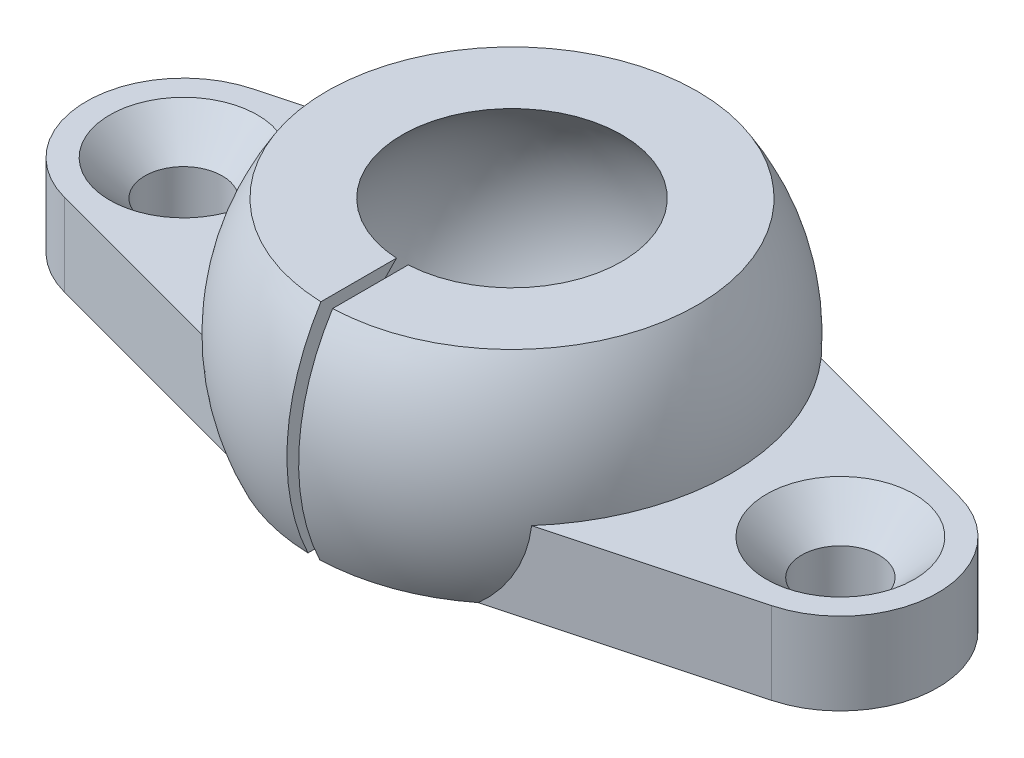
ISO-10303-21;
HEADER;
FILE_DESCRIPTION(('STEP AP214'),'2;1');
FILE_NAME('part.step','',(''),(''),'','','');
FILE_SCHEMA(('AUTOMOTIVE_DESIGN { 1 0 10303 214 1 1 1 1 }'));
ENDSEC;
DATA;
#1=APPLICATION_CONTEXT('core data for automotive mechanical design processes');
#2=APPLICATION_PROTOCOL_DEFINITION('international standard','automotive_design',2000,#1);
#3=PRODUCT_CONTEXT('',#1,'mechanical');
#4=PRODUCT('Part','Part','',(#3));
#5=PRODUCT_RELATED_PRODUCT_CATEGORY('part','',(#4));
#6=PRODUCT_DEFINITION_FORMATION('','',#4);
#7=PRODUCT_DEFINITION_CONTEXT('part definition',#1,'design');
#8=PRODUCT_DEFINITION('design','',#6,#7);
#9=PRODUCT_DEFINITION_SHAPE('','',#8);
#10=(LENGTH_UNIT() NAMED_UNIT(*) SI_UNIT(.MILLI.,.METRE.));
#11=(NAMED_UNIT(*) PLANE_ANGLE_UNIT() SI_UNIT($,.RADIAN.));
#12=(NAMED_UNIT(*) SI_UNIT($,.STERADIAN.) SOLID_ANGLE_UNIT());
#13=UNCERTAINTY_MEASURE_WITH_UNIT(LENGTH_MEASURE(1.E-05),#10,'distance_accuracy_value','');
#14=(GEOMETRIC_REPRESENTATION_CONTEXT(3) GLOBAL_UNCERTAINTY_ASSIGNED_CONTEXT((#13)) GLOBAL_UNIT_ASSIGNED_CONTEXT((#10,
#11,#12)) REPRESENTATION_CONTEXT('',''));
#15=CARTESIAN_POINT('',(0.,0.,0.));
#16=DIRECTION('',(0.,0.,1.));
#17=DIRECTION('',(1.,0.,0.));
#18=AXIS2_PLACEMENT_3D('',#15,#16,#17);
#19=CARTESIAN_POINT('',(0.,0.,0.));
#20=DIRECTION('',(0.,1.,0.));
#21=DIRECTION('',(-1.,0.,0.));
#22=AXIS2_PLACEMENT_3D('',#19,#20,#21);
#23=SPHERICAL_SURFACE('',#22,6.85);
#24=CARTESIAN_POINT('',(-0.25,0.,0.));
#25=DIRECTION('',(-1.,0.,0.));
#26=DIRECTION('',(0.,-1.,0.));
#27=AXIS2_PLACEMENT_3D('',#24,#25,#26);
#28=CIRCLE('',#27,6.84543643604993);
#29=CARTESIAN_POINT('',(-0.25,-3.56370593624109,5.84465567848098));
#30=VERTEX_POINT('',#29);
#31=CARTESIAN_POINT('',(-0.250000000000003,5.,4.67546789102438));
#32=VERTEX_POINT('',#31);
#33=EDGE_CURVE('E377',#30,#32,#28,.T.);
#34=ORIENTED_EDGE('',*,*,#33,.F.);
#35=CARTESIAN_POINT('',(0.,-3.56370593624109,0.));
#36=DIRECTION('',(0.,1.,0.));
#37=DIRECTION('',(-1.,0.,0.));
#38=AXIS2_PLACEMENT_3D('',#35,#36,#37);
#39=CIRCLE('',#38,5.85);
#40=CARTESIAN_POINT('',(0.25,-3.56370593624109,5.84465567848098));
#41=VERTEX_POINT('',#40);
#42=EDGE_CURVE('E371',#41,#30,#39,.T.);
#43=ORIENTED_EDGE('',*,*,#42,.F.);
#44=CARTESIAN_POINT('',(0.25,0.,0.));
#45=DIRECTION('',(-1.,0.,0.));
#46=DIRECTION('',(0.,-1.,0.));
#47=AXIS2_PLACEMENT_3D('',#44,#45,#46);
#48=CIRCLE('',#47,6.84543643604993);
#49=CARTESIAN_POINT('',(0.249999999999997,5.,4.67546789102438));
#50=VERTEX_POINT('',#49);
#51=EDGE_CURVE('E71',#41,#50,#48,.T.);
#52=ORIENTED_EDGE('',*,*,#51,.T.);
#53=CARTESIAN_POINT('',(0.,5.,0.));
#54=DIRECTION('',(0.,1.,0.));
#55=DIRECTION('',(-1.,0.,0.));
#56=AXIS2_PLACEMENT_3D('',#53,#54,#55);
#57=CIRCLE('',#56,4.68214694344378);
#58=EDGE_CURVE('E180',#50,#32,#57,.T.);
#59=ORIENTED_EDGE('',*,*,#58,.T.);
#60=EDGE_LOOP('',(#34,#43,#52,#59));
#61=FACE_BOUND('',#60,.T.);
#62=ADVANCED_FACE('F41',(#61),#23,.F.);
#63=CARTESIAN_POINT('',(-7.90079109963047,5.,0.));
#64=DIRECTION('',(0.,1.,0.));
#65=DIRECTION('',(-1.,0.,0.));
#66=AXIS2_PLACEMENT_3D('',#63,#64,#65);
#67=PLANE('',#66);
#68=DIRECTION('',(0.,0.,1.));
#69=VECTOR('',#68,1.);
#70=CARTESIAN_POINT('',(-0.250000000000001,5.,0.));
#71=LINE('',#70,#69);
#72=CARTESIAN_POINT('',(-0.250000000000003,5.,7.89683480895985));
#73=VERTEX_POINT('',#72);
#74=EDGE_CURVE('E144',#32,#73,#71,.T.);
#75=ORIENTED_EDGE('',*,*,#74,.F.);
#76=ORIENTED_EDGE('',*,*,#58,.F.);
#77=DIRECTION('',(0.,0.,1.));
#78=VECTOR('',#77,1.);
#79=CARTESIAN_POINT('',(0.249999999999999,5.,0.));
#80=LINE('',#79,#78);
#81=CARTESIAN_POINT('',(0.249999999999997,5.,7.89683480895985));
#82=VERTEX_POINT('',#81);
#83=EDGE_CURVE('E385',#50,#82,#80,.T.);
#84=ORIENTED_EDGE('',*,*,#83,.T.);
#85=CARTESIAN_POINT('',(0.,5.,0.));
#86=DIRECTION('',(0.,1.,0.));
#87=DIRECTION('',(-1.,0.,0.));
#88=AXIS2_PLACEMENT_3D('',#85,#86,#87);
#89=CIRCLE('',#88,7.90079109963047);
#90=EDGE_CURVE('E174',#82,#73,#89,.T.);
#91=ORIENTED_EDGE('',*,*,#90,.T.);
#92=EDGE_LOOP('',(#75,#76,#84,#91));
#93=FACE_BOUND('',#92,.T.);
#94=ADVANCED_FACE('F266',(#93),#67,.T.);
#95=CARTESIAN_POINT('',(0.,0.,0.));
#96=DIRECTION('',(0.,1.,0.));
#97=DIRECTION('',(-1.,0.,0.));
#98=AXIS2_PLACEMENT_3D('',#95,#96,#97);
#99=SPHERICAL_SURFACE('',#98,9.35);
#100=CARTESIAN_POINT('',(-0.25,0.,0.));
#101=DIRECTION('',(-1.,0.,0.));
#102=DIRECTION('',(0.,-1.,0.));
#103=AXIS2_PLACEMENT_3D('',#100,#101,#102);
#104=CIRCLE('',#103,9.34665715643834);
#105=CARTESIAN_POINT('',(-0.250000000000001,-4.00000000000001,8.44748483277715));
#106=VERTEX_POINT('',#105);
#107=EDGE_CURVE('E141',#73,#106,#104,.F.);
#108=ORIENTED_EDGE('',*,*,#107,.F.);
#109=ORIENTED_EDGE('',*,*,#90,.F.);
#110=CARTESIAN_POINT('',(0.25,0.,0.));
#111=DIRECTION('',(-1.,0.,0.));
#112=DIRECTION('',(0.,-1.,0.));
#113=AXIS2_PLACEMENT_3D('',#110,#111,#112);
#114=CIRCLE('',#113,9.34665715643834);
#115=CARTESIAN_POINT('',(0.249999999999999,-4.00000000000001,8.44748483277715));
#116=VERTEX_POINT('',#115);
#117=EDGE_CURVE('E379',#82,#116,#114,.F.);
#118=ORIENTED_EDGE('',*,*,#117,.T.);
#119=CARTESIAN_POINT('',(0.,-4.,0.));
#120=DIRECTION('',(0.,1.,0.));
#121=DIRECTION('',(-1.,0.,0.));
#122=AXIS2_PLACEMENT_3D('',#119,#120,#121);
#123=CIRCLE('',#122,8.45118334909378);
#124=CARTESIAN_POINT('',(5.21491093730875,-4.,6.65035366848543));
#125=VERTEX_POINT('',#124);
#126=EDGE_CURVE('E170',#116,#125,#123,.T.);
#127=ORIENTED_EDGE('',*,*,#126,.T.);
#128=CARTESIAN_POINT('',(2.01192121068436,0.,7.5085921790996));
#129=DIRECTION('',(0.258819045102518,0.,0.965925826289069));
#130=DIRECTION('',(0.965925826289069,0.,-0.258819045102518));
#131=AXIS2_PLACEMENT_3D('',#128,#129,#130);
#132=CIRCLE('',#131,5.19574022926114);
#133=CARTESIAN_POINT('',(7.00732842568334,-0.499999999999997,6.17007684997604));
#134=VERTEX_POINT('',#133);
#135=EDGE_CURVE('E362',#134,#125,#132,.F.);
#136=ORIENTED_EDGE('',*,*,#135,.F.);
#137=CARTESIAN_POINT('',(0.,-0.499999999999999,0.));
#138=DIRECTION('',(0.,-1.,0.));
#139=DIRECTION('',(1.,0.,0.));
#140=AXIS2_PLACEMENT_3D('',#137,#138,#139);
#141=CIRCLE('',#140,9.33662144461261);
#142=CARTESIAN_POINT('',(7.00732842568334,-0.499999999999997,-6.17007684997604));
#143=VERTEX_POINT('',#142);
#144=EDGE_CURVE('E184',#134,#143,#141,.F.);
#145=ORIENTED_EDGE('',*,*,#144,.T.);
#146=CARTESIAN_POINT('',(2.01192121068436,0.,-7.5085921790996));
#147=DIRECTION('',(0.258819045102518,0.,-0.965925826289069));
#148=DIRECTION('',(-0.965925826289069,0.,-0.258819045102518));
#149=AXIS2_PLACEMENT_3D('',#146,#147,#148);
#150=CIRCLE('',#149,5.19574022926114);
#151=CARTESIAN_POINT('',(5.21491093730875,-4.,-6.65035366848543));
#152=VERTEX_POINT('',#151);
#153=EDGE_CURVE('E368',#152,#143,#150,.F.);
#154=ORIENTED_EDGE('',*,*,#153,.F.);
#155=CARTESIAN_POINT('',(-5.21491093730875,-4.,-6.65035366848543));
#156=VERTEX_POINT('',#155);
#157=EDGE_CURVE('E169',#152,#156,#123,.T.);
#158=ORIENTED_EDGE('',*,*,#157,.T.);
#159=CARTESIAN_POINT('',(-2.01192121068436,0.,-7.5085921790996));
#160=DIRECTION('',(-0.258819045102518,0.,-0.965925826289069));
#161=DIRECTION('',(-0.965925826289069,0.,0.258819045102518));
#162=AXIS2_PLACEMENT_3D('',#159,#160,#161);
#163=CIRCLE('',#162,5.19574022926114);
#164=CARTESIAN_POINT('',(-7.00732842568334,-0.500000000000001,-6.17007684997604));
#165=VERTEX_POINT('',#164);
#166=EDGE_CURVE('E299',#165,#156,#163,.F.);
#167=ORIENTED_EDGE('',*,*,#166,.F.);
#168=CARTESIAN_POINT('',(0.,-0.499999999999999,0.));
#169=DIRECTION('',(0.,-1.,0.));
#170=DIRECTION('',(1.,0.,0.));
#171=AXIS2_PLACEMENT_3D('',#168,#169,#170);
#172=CIRCLE('',#171,9.33662144461261);
#173=CARTESIAN_POINT('',(-7.00732842568334,-0.500000000000001,6.17007684997604));
#174=VERTEX_POINT('',#173);
#175=EDGE_CURVE('E187',#165,#174,#172,.F.);
#176=ORIENTED_EDGE('',*,*,#175,.T.);
#177=CARTESIAN_POINT('',(-2.01192121068436,0.,7.50859217909961));
#178=DIRECTION('',(-0.258819045102518,0.,0.965925826289069));
#179=DIRECTION('',(0.965925826289069,0.,0.258819045102518));
#180=AXIS2_PLACEMENT_3D('',#177,#178,#179);
#181=CIRCLE('',#180,5.19574022926114);
#182=CARTESIAN_POINT('',(-5.21491093730875,-4.,6.65035366848543));
#183=VERTEX_POINT('',#182);
#184=EDGE_CURVE('E166',#183,#174,#181,.F.);
#185=ORIENTED_EDGE('',*,*,#184,.F.);
#186=EDGE_CURVE('E156',#183,#106,#123,.T.);
#187=ORIENTED_EDGE('',*,*,#186,.T.);
#188=EDGE_LOOP('',(#108,#109,#118,#127,#136,#145,#154,#158,#167,#176,#185,#187));
#189=FACE_BOUND('',#188,.T.);
#190=ADVANCED_FACE('F164',(#189),#99,.T.);
#191=CARTESIAN_POINT('',(-6.56619833921587,-4.,0.));
#192=DIRECTION('',(0.,-1.,0.));
#193=DIRECTION('',(1.,0.,0.));
#194=AXIS2_PLACEMENT_3D('',#191,#192,#193);
#195=PLANE('',#194);
#196=DIRECTION('',(0.,0.,1.));
#197=VECTOR('',#196,1.);
#198=CARTESIAN_POINT('',(-0.249999999999999,-4.00000000000001,0.));
#199=LINE('',#198,#197);
#200=CARTESIAN_POINT('',(-0.25,-4.,6.5614373905358));
#201=VERTEX_POINT('',#200);
#202=EDGE_CURVE('E63',#201,#106,#199,.T.);
#203=ORIENTED_EDGE('',*,*,#202,.T.);
#204=ORIENTED_EDGE('',*,*,#186,.F.);
#205=DIRECTION('',(-0.965925826289069,0.,-0.258819045102518));
#206=VECTOR('',#205,1.);
#207=CARTESIAN_POINT('',(-15.0740990371754,-4.,4.00859217909964));
#208=LINE('',#207,#206);
#209=CARTESIAN_POINT('',(-15.0740990371754,-4.,4.00859217909964));
#210=VERTEX_POINT('',#209);
#211=EDGE_CURVE('E308',#183,#210,#208,.T.);
#212=ORIENTED_EDGE('',*,*,#211,.T.);
#213=CARTESIAN_POINT('',(-14.,-4.,0.));
#214=DIRECTION('',(0.,-1.,0.));
#215=DIRECTION('',(1.,0.,0.));
#216=AXIS2_PLACEMENT_3D('',#213,#214,#215);
#217=CIRCLE('',#216,4.15);
#218=CARTESIAN_POINT('',(-15.0740990371754,-4.,-4.00859217909964));
#219=VERTEX_POINT('',#218);
#220=EDGE_CURVE('E312',#210,#219,#217,.T.);
#221=ORIENTED_EDGE('',*,*,#220,.T.);
#222=DIRECTION('',(0.965925826289069,0.,-0.258819045102518));
#223=VECTOR('',#222,1.);
#224=CARTESIAN_POINT('',(-3.37648299815732,-4.,-7.14295895012386));
#225=LINE('',#224,#223);
#226=EDGE_CURVE('E316',#219,#156,#225,.T.);
#227=ORIENTED_EDGE('',*,*,#226,.T.);
#228=ORIENTED_EDGE('',*,*,#157,.F.);
#229=DIRECTION('',(0.965925826289069,0.,0.258819045102518));
#230=VECTOR('',#229,1.);
#231=CARTESIAN_POINT('',(3.37648299815732,-4.,-7.14295895012386));
#232=LINE('',#231,#230);
#233=CARTESIAN_POINT('',(15.0740990371755,-3.99999999999999,-4.00859217909964));
#234=VERTEX_POINT('',#233);
#235=EDGE_CURVE('E341',#152,#234,#232,.T.);
#236=ORIENTED_EDGE('',*,*,#235,.T.);
#237=CARTESIAN_POINT('',(14.,-3.99999999999999,0.));
#238=DIRECTION('',(0.,-1.,0.));
#239=DIRECTION('',(1.,0.,0.));
#240=AXIS2_PLACEMENT_3D('',#237,#238,#239);
#241=CIRCLE('',#240,4.15);
#242=CARTESIAN_POINT('',(15.0740990371754,-3.99999999999999,4.00859217909964));
#243=VERTEX_POINT('',#242);
#244=EDGE_CURVE('E335',#234,#243,#241,.T.);
#245=ORIENTED_EDGE('',*,*,#244,.T.);
#246=DIRECTION('',(-0.965925826289069,0.,0.258819045102518));
#247=VECTOR('',#246,1.);
#248=CARTESIAN_POINT('',(15.0740990371754,-3.99999999999999,4.00859217909964));
#249=LINE('',#248,#247);
#250=EDGE_CURVE('E352',#243,#125,#249,.T.);
#251=ORIENTED_EDGE('',*,*,#250,.T.);
#252=ORIENTED_EDGE('',*,*,#126,.F.);
#253=DIRECTION('',(0.,0.,1.));
#254=VECTOR('',#253,1.);
#255=CARTESIAN_POINT('',(0.250000000000001,-4.00000000000001,0.));
#256=LINE('',#255,#254);
#257=CARTESIAN_POINT('',(0.25,-4.00000000000001,6.56143739053581));
#258=VERTEX_POINT('',#257);
#259=EDGE_CURVE('E162',#258,#116,#256,.T.);
#260=ORIENTED_EDGE('',*,*,#259,.F.);
#261=CARTESIAN_POINT('',(0.,-4.,0.));
#262=DIRECTION('',(0.,1.,0.));
#263=DIRECTION('',(-1.,0.,0.));
#264=AXIS2_PLACEMENT_3D('',#261,#262,#263);
#265=CIRCLE('',#264,6.56619833921587);
#266=EDGE_CURVE('E160',#258,#201,#265,.T.);
#267=ORIENTED_EDGE('',*,*,#266,.T.);
#268=EDGE_LOOP('',(#203,#204,#212,#221,#227,#228,#236,#245,#251,#252,#260,#267));
#269=FACE_BOUND('',#268,.T.);
#270=CARTESIAN_POINT('',(14.,-3.99999999999999,0.));
#271=DIRECTION('',(0.,-1.,0.));
#272=DIRECTION('',(1.,0.,0.));
#273=AXIS2_PLACEMENT_3D('',#270,#271,#272);
#274=CIRCLE('',#273,1.65);
#275=CARTESIAN_POINT('',(15.65,-3.99999999999999,0.));
#276=VERTEX_POINT('',#275);
#277=EDGE_CURVE('E331',#276,#276,#274,.T.);
#278=ORIENTED_EDGE('',*,*,#277,.F.);
#279=EDGE_LOOP('',(#278));
#280=FACE_BOUND('',#279,.T.);
#281=CARTESIAN_POINT('',(-14.,-4.,0.));
#282=DIRECTION('',(0.,-1.,0.));
#283=DIRECTION('',(1.,0.,0.));
#284=AXIS2_PLACEMENT_3D('',#281,#282,#283);
#285=CIRCLE('',#284,1.65);
#286=CARTESIAN_POINT('',(-12.35,-4.,0.));
#287=VERTEX_POINT('',#286);
#288=EDGE_CURVE('E150',#287,#287,#285,.T.);
#289=ORIENTED_EDGE('',*,*,#288,.F.);
#290=EDGE_LOOP('',(#289));
#291=FACE_BOUND('',#290,.T.);
#292=ADVANCED_FACE('F154',(#269,#280,#291),#195,.T.);
#293=CARTESIAN_POINT('',(0.,-4.,0.));
#294=DIRECTION('',(0.,-1.,0.));
#295=DIRECTION('',(1.,0.,0.));
#296=AXIS2_PLACEMENT_3D('',#293,#294,#295);
#297=CONICAL_SURFACE('',#296,6.56619833921587,1.02365378895935);
#298=CARTESIAN_POINT('',(-0.25,-4.0007,6.56258730886968));
#299=CARTESIAN_POINT('',(-0.25,-3.79203605968382,6.21979491039334));
#300=CARTESIAN_POINT('',(-0.25,-3.58338011025822,5.87699762131281));
#301=CARTESIAN_POINT('',(-0.25,-3.16612496373921,5.19136193314967));
#302=CARTESIAN_POINT('',(-0.25,-2.95752576748086,4.84852353355888));
#303=CARTESIAN_POINT('',(-0.25,-2.53926748953039,4.16087140498777));
#304=CARTESIAN_POINT('',(-0.25,-2.32960898600546,3.8160573244824));
#305=CARTESIAN_POINT('',(-0.25,-1.91049967216925,3.12630918369924));
#306=CARTESIAN_POINT('',(-0.25,-1.70104885908318,2.78137512510987));
#307=CARTESIAN_POINT('',(-0.25,-1.41538299560139,2.30996462605388));
#308=CARTESIAN_POINT('',(-0.25,-1.33889727185218,2.18365221667943));
#309=CARTESIAN_POINT('',(-0.25,-1.18606839080282,1.93093573838817));
#310=CARTESIAN_POINT('',(-0.25,-1.10972523795582,1.80453166677401));
#311=CARTESIAN_POINT('',(-0.25,-0.957514310010022,1.55190705866557));
#312=CARTESIAN_POINT('',(-0.25,-0.881645806424043,1.42568696048364));
#313=CARTESIAN_POINT('',(-0.25,-0.730429142164725,1.17294898469878));
#314=CARTESIAN_POINT('',(-0.25,-0.655080934891074,1.04643113516137));
#315=CARTESIAN_POINT('',(-0.25,-0.552756412658992,0.872338757139789));
#316=CARTESIAN_POINT('',(-0.25,-0.525148723513008,0.825136368574723));
#317=CARTESIAN_POINT('',(-0.25,-0.470273139245141,0.730520484331053));
#318=CARTESIAN_POINT('',(-0.25,-0.443005320769882,0.683106944193085));
#319=CARTESIAN_POINT('',(-0.25,-0.38888539201587,0.5876549449805));
#320=CARTESIAN_POINT('',(-0.25,-0.362036856629112,0.539614436692938));
#321=CARTESIAN_POINT('',(-0.25,-0.322661728981087,0.467077862729114));
#322=CARTESIAN_POINT('',(-0.25,-0.309688909797546,0.442824808098209));
#323=CARTESIAN_POINT('',(-0.25,-0.284196173906107,0.394082621666878));
#324=CARTESIAN_POINT('',(-0.25,-0.271676217966321,0.369593510550114));
#325=CARTESIAN_POINT('',(-0.25,-0.249566836729092,0.324767943894769));
#326=CARTESIAN_POINT('',(-0.25,-0.239859787385058,0.304489867526525));
#327=CARTESIAN_POINT('',(-0.25,-0.22116360840782,0.263608088254685));
#328=CARTESIAN_POINT('',(-0.25,-0.212174266350144,0.243004483878651));
#329=CARTESIAN_POINT('',(-0.25,-0.19540039459809,0.201555178192709));
#330=CARTESIAN_POINT('',(-0.25,-0.187604242941366,0.180714265584528));
#331=CARTESIAN_POINT('',(-0.25,-0.173758211726736,0.138471545690703));
#332=CARTESIAN_POINT('',(-0.25,-0.167705364282423,0.117070760151613));
#333=CARTESIAN_POINT('',(-0.25,-0.159597173477799,0.0796732806368716));
#334=CARTESIAN_POINT('',(-0.25,-0.156898971091526,0.0638215072081142));
#335=CARTESIAN_POINT('',(-0.25,-0.153206510816522,0.0317592753915554));
#336=CARTESIAN_POINT('',(-0.25,-0.152230243448775,0.0155468015782275));
#337=CARTESIAN_POINT('',(-0.25,-0.152295722476121,-0.000700000000000062));
#338=B_SPLINE_CURVE_WITH_KNOTS('',3,(#298,#299,#300,#301,#302,#303,#304,#305,#306,#307,#308,
#309,#310,#311,#312,#313,#314,#315,#316,#317,#318,#319,#320,#321,#322,#323,#324,#325,#326,#327,
#328,#329,#330,#331,#332,#333,#334,#335,#336,#337),.UNSPECIFIED.,.F.,.F.,(4,2,2,2,2,2,2,2,2,2,2,
2,2,2,2,2,2,2,2,4),(0.,1.20392089291616,2.40785863368443,3.61851178261971,4.82914853286378,
5.27214290352746,5.71515088701696,6.15695183477718,6.59871268560253,6.76276112611679,
6.92684591629358,7.09193697514014,7.17444811162307,7.25695208289951,7.3243887709009,
7.39180542465991,7.45851669046847,7.52511370319128,7.57326547989776,7.62191742391162),.UNSPECIFIED.);
#339=EDGE_CURVE('E11',#201,#30,#338,.T.);
#340=ORIENTED_EDGE('',*,*,#339,.F.);
#341=ORIENTED_EDGE('',*,*,#266,.F.);
#342=CARTESIAN_POINT('',(0.25,-4.0007,6.56258730886968));
#343=CARTESIAN_POINT('',(0.25,-3.79203605968382,6.21979491039334));
#344=CARTESIAN_POINT('',(0.25,-3.58338011025822,5.87699762131282));
#345=CARTESIAN_POINT('',(0.25,-3.16612496373921,5.19136193314968));
#346=CARTESIAN_POINT('',(0.25,-2.95752576748086,4.84852353355889));
#347=CARTESIAN_POINT('',(0.25,-2.5392674895304,4.16087140498779));
#348=CARTESIAN_POINT('',(0.25,-2.32960898600547,3.81605732448242));
#349=CARTESIAN_POINT('',(0.25,-1.91049967216927,3.12630918369926));
#350=CARTESIAN_POINT('',(0.25,-1.70104885908319,2.7813751251099));
#351=CARTESIAN_POINT('',(0.25,-1.41538299560141,2.3099646260539));
#352=CARTESIAN_POINT('',(0.25,-1.3388972718522,2.18365221667945));
#353=CARTESIAN_POINT('',(0.25,-1.18606839080283,1.93093573838819));
#354=CARTESIAN_POINT('',(0.25,-1.10972523795583,1.80453166677403));
#355=CARTESIAN_POINT('',(0.25,-0.957514310010032,1.55190705866558));
#356=CARTESIAN_POINT('',(0.25,-0.881645806424052,1.42568696048365));
#357=CARTESIAN_POINT('',(0.25,-0.730429142164732,1.17294898469879));
#358=CARTESIAN_POINT('',(0.25,-0.655080934891081,1.04643113516138));
#359=CARTESIAN_POINT('',(0.25,-0.552756412658997,0.872338757139797));
#360=CARTESIAN_POINT('',(0.25,-0.525148723513013,0.825136368574731));
#361=CARTESIAN_POINT('',(0.25,-0.470273139245145,0.73052048433106));
#362=CARTESIAN_POINT('',(0.25,-0.443005320769886,0.683106944193091));
#363=CARTESIAN_POINT('',(0.25,-0.388885392015873,0.587654944980505));
#364=CARTESIAN_POINT('',(0.25,-0.362036856629115,0.539614436692943));
#365=CARTESIAN_POINT('',(0.25,-0.32266172898109,0.467077862729118));
#366=CARTESIAN_POINT('',(0.25,-0.309688909797548,0.442824808098213));
#367=CARTESIAN_POINT('',(0.25,-0.284196173906109,0.394082621666881));
#368=CARTESIAN_POINT('',(0.25,-0.271676217966323,0.369593510550117));
#369=CARTESIAN_POINT('',(0.25,-0.249566836729094,0.324767943894772));
#370=CARTESIAN_POINT('',(0.25,-0.239859787385059,0.304489867526528));
#371=CARTESIAN_POINT('',(0.25,-0.221163608407821,0.263608088254689));
#372=CARTESIAN_POINT('',(0.25,-0.212174266350146,0.243004483878654));
#373=CARTESIAN_POINT('',(0.25,-0.195400394598092,0.201555178192711));
#374=CARTESIAN_POINT('',(0.25,-0.187604242941366,0.18071426558453));
#375=CARTESIAN_POINT('',(0.25,-0.173758211726737,0.138471545690704));
#376=CARTESIAN_POINT('',(0.25,-0.167705364282425,0.117070760151614));
#377=CARTESIAN_POINT('',(0.25,-0.159597173477801,0.0796732806368725));
#378=CARTESIAN_POINT('',(0.25,-0.156898971091527,0.063821507208115));
#379=CARTESIAN_POINT('',(0.25,-0.153206510816523,0.0317592753915559));
#380=CARTESIAN_POINT('',(0.25,-0.152230243448775,0.0155468015782278));
#381=CARTESIAN_POINT('',(0.25,-0.152295722476122,-0.000700000000000029));
#382=B_SPLINE_CURVE_WITH_KNOTS('',3,(#342,#343,#344,#345,#346,#347,#348,#349,#350,#351,#352,
#353,#354,#355,#356,#357,#358,#359,#360,#361,#362,#363,#364,#365,#366,#367,#368,#369,#370,#371,
#372,#373,#374,#375,#376,#377,#378,#379,#380,#381),.UNSPECIFIED.,.F.,.F.,(4,2,2,2,2,2,2,2,2,2,2,
2,2,2,2,2,2,2,2,4),(0.,1.20392089291615,2.40785863368442,3.61851178261969,4.82914853286375,
5.27214290352744,5.71515088701694,6.15695183477717,6.59871268560252,6.76276112611678,
6.92684591629357,7.09193697514014,7.17444811162307,7.25695208289951,7.3243887709009,
7.39180542465991,7.45851669046847,7.52511370319127,7.57326547989776,7.62191742391162),.UNSPECIFIED.);
#383=EDGE_CURVE('E57',#258,#41,#382,.T.);
#384=ORIENTED_EDGE('',*,*,#383,.T.);
#385=ORIENTED_EDGE('',*,*,#42,.T.);
#386=EDGE_LOOP('',(#340,#341,#384,#385));
#387=FACE_BOUND('',#386,.T.);
#388=ADVANCED_FACE('F211',(#387),#297,.F.);
#389=CARTESIAN_POINT('',(14.,-0.499999999999995,0.));
#390=DIRECTION('',(0.,-1.,0.));
#391=DIRECTION('',(1.,0.,0.));
#392=AXIS2_PLACEMENT_3D('',#389,#390,#391);
#393=CYLINDRICAL_SURFACE('',#392,4.15);
#394=ORIENTED_EDGE('',*,*,#244,.F.);
#395=DIRECTION('',(0.,-1.,0.));
#396=VECTOR('',#395,1.);
#397=CARTESIAN_POINT('',(15.0740990371755,-0.499999999999995,-4.00859217909964));
#398=LINE('',#397,#396);
#399=CARTESIAN_POINT('',(15.0740990371755,-0.499999999999995,-4.00859217909964));
#400=VERTEX_POINT('',#399);
#401=EDGE_CURVE('E358',#400,#234,#398,.T.);
#402=ORIENTED_EDGE('',*,*,#401,.F.);
#403=CARTESIAN_POINT('',(14.,-0.499999999999995,0.));
#404=DIRECTION('',(0.,-1.,0.));
#405=DIRECTION('',(1.,0.,0.));
#406=AXIS2_PLACEMENT_3D('',#403,#404,#405);
#407=CIRCLE('',#406,4.15);
#408=CARTESIAN_POINT('',(15.0740990371754,-0.499999999999995,4.00859217909964));
#409=VERTEX_POINT('',#408);
#410=EDGE_CURVE('E336',#400,#409,#407,.T.);
#411=ORIENTED_EDGE('',*,*,#410,.T.);
#412=DIRECTION('',(0.,-1.,0.));
#413=VECTOR('',#412,1.);
#414=CARTESIAN_POINT('',(15.0740990371754,-0.499999999999995,4.00859217909964));
#415=LINE('',#414,#413);
#416=EDGE_CURVE('E348',#409,#243,#415,.T.);
#417=ORIENTED_EDGE('',*,*,#416,.T.);
#418=EDGE_LOOP('',(#394,#402,#411,#417));
#419=FACE_BOUND('',#418,.T.);
#420=ADVANCED_FACE('F254',(#419),#393,.T.);
#421=CARTESIAN_POINT('',(3.37648299815732,-0.499999999999998,-7.14295895012386));
#422=DIRECTION('',(0.258819045102518,0.,-0.965925826289069));
#423=DIRECTION('',(-0.965925826289069,0.,-0.258819045102518));
#424=AXIS2_PLACEMENT_3D('',#421,#422,#423);
#425=PLANE('',#424);
#426=ORIENTED_EDGE('',*,*,#235,.F.);
#427=ORIENTED_EDGE('',*,*,#153,.T.);
#428=DIRECTION('',(0.965925826289069,0.,0.258819045102518));
#429=VECTOR('',#428,1.);
#430=CARTESIAN_POINT('',(3.37648299815732,-0.499999999999998,-7.14295895012386));
#431=LINE('',#430,#429);
#432=EDGE_CURVE('E345',#143,#400,#431,.T.);
#433=ORIENTED_EDGE('',*,*,#432,.T.);
#434=ORIENTED_EDGE('',*,*,#401,.T.);
#435=EDGE_LOOP('',(#426,#427,#433,#434));
#436=FACE_BOUND('',#435,.T.);
#437=ADVANCED_FACE('F251',(#436),#425,.T.);
#438=CARTESIAN_POINT('',(15.0740990371754,-0.499999999999995,4.00859217909964));
#439=DIRECTION('',(0.258819045102518,0.,0.965925826289069));
#440=DIRECTION('',(0.965925826289069,0.,-0.258819045102518));
#441=AXIS2_PLACEMENT_3D('',#438,#439,#440);
#442=PLANE('',#441);
#443=DIRECTION('',(-0.965925826289069,0.,0.258819045102518));
#444=VECTOR('',#443,1.);
#445=CARTESIAN_POINT('',(15.0740990371754,-0.499999999999995,4.00859217909964));
#446=LINE('',#445,#444);
#447=EDGE_CURVE('E340',#409,#134,#446,.T.);
#448=ORIENTED_EDGE('',*,*,#447,.T.);
#449=ORIENTED_EDGE('',*,*,#135,.T.);
#450=ORIENTED_EDGE('',*,*,#250,.F.);
#451=ORIENTED_EDGE('',*,*,#416,.F.);
#452=EDGE_LOOP('',(#448,#449,#450,#451));
#453=FACE_BOUND('',#452,.T.);
#454=ADVANCED_FACE('F249',(#453),#442,.T.);
#455=CARTESIAN_POINT('',(14.,-0.499999999999995,0.));
#456=DIRECTION('',(0.,-1.,0.));
#457=DIRECTION('',(1.,0.,0.));
#458=AXIS2_PLACEMENT_3D('',#455,#456,#457);
#459=PLANE('',#458);
#460=CARTESIAN_POINT('',(14.,-0.499999999999995,0.));
#461=DIRECTION('',(0.,-1.,0.));
#462=DIRECTION('',(1.,0.,0.));
#463=AXIS2_PLACEMENT_3D('',#460,#461,#462);
#464=CIRCLE('',#463,3.15);
#465=CARTESIAN_POINT('',(17.15,-0.499999999999994,0.));
#466=VERTEX_POINT('',#465);
#467=EDGE_CURVE('E198',#466,#466,#464,.T.);
#468=ORIENTED_EDGE('',*,*,#467,.T.);
#469=EDGE_LOOP('',(#468));
#470=FACE_BOUND('',#469,.T.);
#471=ORIENTED_EDGE('',*,*,#144,.F.);
#472=ORIENTED_EDGE('',*,*,#447,.F.);
#473=ORIENTED_EDGE('',*,*,#410,.F.);
#474=ORIENTED_EDGE('',*,*,#432,.F.);
#475=EDGE_LOOP('',(#471,#472,#473,#474));
#476=FACE_BOUND('',#475,.T.);
#477=ADVANCED_FACE('F245',(#470,#476),#459,.F.);
#478=CARTESIAN_POINT('',(14.,-0.499999999999995,0.));
#479=DIRECTION('',(0.,-1.,0.));
#480=DIRECTION('',(1.,0.,0.));
#481=AXIS2_PLACEMENT_3D('',#478,#479,#480);
#482=CYLINDRICAL_SURFACE('',#481,1.65);
#483=CARTESIAN_POINT('',(14.,-2.,0.));
#484=DIRECTION('',(0.,-1.,0.));
#485=DIRECTION('',(0.,0.,-1.));
#486=AXIS2_PLACEMENT_3D('',#483,#484,#485);
#487=CIRCLE('',#486,1.65);
#488=CARTESIAN_POINT('',(14.,-2.,-1.65));
#489=VERTEX_POINT('',#488);
#490=EDGE_CURVE('E202',#489,#489,#487,.F.);
#491=ORIENTED_EDGE('',*,*,#490,.T.);
#492=EDGE_LOOP('',(#491));
#493=FACE_BOUND('',#492,.T.);
#494=ORIENTED_EDGE('',*,*,#277,.T.);
#495=EDGE_LOOP('',(#494));
#496=FACE_BOUND('',#495,.T.);
#497=ADVANCED_FACE('F241',(#493,#496),#482,.F.);
#498=CARTESIAN_POINT('',(-14.,-0.500000000000003,0.));
#499=DIRECTION('',(0.,-1.,0.));
#500=DIRECTION('',(1.,0.,0.));
#501=AXIS2_PLACEMENT_3D('',#498,#499,#500);
#502=CYLINDRICAL_SURFACE('',#501,4.15);
#503=ORIENTED_EDGE('',*,*,#220,.F.);
#504=DIRECTION('',(0.,-1.,0.));
#505=VECTOR('',#504,1.);
#506=CARTESIAN_POINT('',(-15.0740990371755,-0.500000000000003,4.00859217909964));
#507=LINE('',#506,#505);
#508=CARTESIAN_POINT('',(-15.0740990371755,-0.500000000000003,4.00859217909964));
#509=VERTEX_POINT('',#508);
#510=EDGE_CURVE('E321',#509,#210,#507,.T.);
#511=ORIENTED_EDGE('',*,*,#510,.F.);
#512=CARTESIAN_POINT('',(-14.,-0.500000000000003,0.));
#513=DIRECTION('',(0.,-1.,0.));
#514=DIRECTION('',(1.,0.,0.));
#515=AXIS2_PLACEMENT_3D('',#512,#513,#514);
#516=CIRCLE('',#515,4.15);
#517=CARTESIAN_POINT('',(-15.0740990371755,-0.500000000000003,-4.00859217909964));
#518=VERTEX_POINT('',#517);
#519=EDGE_CURVE('E303',#509,#518,#516,.T.);
#520=ORIENTED_EDGE('',*,*,#519,.T.);
#521=DIRECTION('',(0.,-1.,0.));
#522=VECTOR('',#521,1.);
#523=CARTESIAN_POINT('',(-15.0740990371755,-0.500000000000003,-4.00859217909964));
#524=LINE('',#523,#522);
#525=EDGE_CURVE('E301',#518,#219,#524,.T.);
#526=ORIENTED_EDGE('',*,*,#525,.T.);
#527=EDGE_LOOP('',(#503,#511,#520,#526));
#528=FACE_BOUND('',#527,.T.);
#529=ADVANCED_FACE('F234',(#528),#502,.T.);
#530=CARTESIAN_POINT('',(-15.0740990371755,-0.500000000000003,4.00859217909964));
#531=DIRECTION('',(-0.258819045102518,0.,0.965925826289069));
#532=DIRECTION('',(0.965925826289069,0.,0.258819045102518));
#533=AXIS2_PLACEMENT_3D('',#530,#531,#532);
#534=PLANE('',#533);
#535=ORIENTED_EDGE('',*,*,#211,.F.);
#536=ORIENTED_EDGE('',*,*,#184,.T.);
#537=DIRECTION('',(-0.965925826289069,0.,-0.258819045102518));
#538=VECTOR('',#537,1.);
#539=CARTESIAN_POINT('',(-15.0740990371755,-0.500000000000003,4.00859217909964));
#540=LINE('',#539,#538);
#541=EDGE_CURVE('E296',#174,#509,#540,.T.);
#542=ORIENTED_EDGE('',*,*,#541,.T.);
#543=ORIENTED_EDGE('',*,*,#510,.T.);
#544=EDGE_LOOP('',(#535,#536,#542,#543));
#545=FACE_BOUND('',#544,.T.);
#546=ADVANCED_FACE('F231',(#545),#534,.T.);
#547=CARTESIAN_POINT('',(-3.37648299815732,-0.5,-7.14295895012386));
#548=DIRECTION('',(-0.258819045102518,0.,-0.965925826289069));
#549=DIRECTION('',(-0.965925826289069,0.,0.258819045102518));
#550=AXIS2_PLACEMENT_3D('',#547,#548,#549);
#551=PLANE('',#550);
#552=DIRECTION('',(0.965925826289069,0.,-0.258819045102518));
#553=VECTOR('',#552,1.);
#554=CARTESIAN_POINT('',(-3.37648299815732,-0.5,-7.14295895012386));
#555=LINE('',#554,#553);
#556=EDGE_CURVE('E294',#518,#165,#555,.T.);
#557=ORIENTED_EDGE('',*,*,#556,.T.);
#558=ORIENTED_EDGE('',*,*,#166,.T.);
#559=ORIENTED_EDGE('',*,*,#226,.F.);
#560=ORIENTED_EDGE('',*,*,#525,.F.);
#561=EDGE_LOOP('',(#557,#558,#559,#560));
#562=FACE_BOUND('',#561,.T.);
#563=ADVANCED_FACE('F229',(#562),#551,.T.);
#564=CARTESIAN_POINT('',(-14.,-0.500000000000003,0.));
#565=DIRECTION('',(0.,-1.,0.));
#566=DIRECTION('',(1.,0.,0.));
#567=AXIS2_PLACEMENT_3D('',#564,#565,#566);
#568=PLANE('',#567);
#569=CARTESIAN_POINT('',(-14.,-0.500000000000003,0.));
#570=DIRECTION('',(0.,-1.,0.));
#571=DIRECTION('',(1.,0.,0.));
#572=AXIS2_PLACEMENT_3D('',#569,#570,#571);
#573=CIRCLE('',#572,3.15);
#574=CARTESIAN_POINT('',(-10.85,-0.500000000000003,0.));
#575=VERTEX_POINT('',#574);
#576=EDGE_CURVE('E190',#575,#575,#573,.T.);
#577=ORIENTED_EDGE('',*,*,#576,.T.);
#578=EDGE_LOOP('',(#577));
#579=FACE_BOUND('',#578,.T.);
#580=ORIENTED_EDGE('',*,*,#175,.F.);
#581=ORIENTED_EDGE('',*,*,#556,.F.);
#582=ORIENTED_EDGE('',*,*,#519,.F.);
#583=ORIENTED_EDGE('',*,*,#541,.F.);
#584=EDGE_LOOP('',(#580,#581,#582,#583));
#585=FACE_BOUND('',#584,.T.);
#586=ADVANCED_FACE('F225',(#579,#585),#568,.F.);
#587=CARTESIAN_POINT('',(-14.,-0.500000000000003,0.));
#588=DIRECTION('',(0.,-1.,0.));
#589=DIRECTION('',(1.,0.,0.));
#590=AXIS2_PLACEMENT_3D('',#587,#588,#589);
#591=CYLINDRICAL_SURFACE('',#590,1.65);
#592=CARTESIAN_POINT('',(-14.,-2.00000000000001,0.));
#593=DIRECTION('',(0.,-1.,0.));
#594=DIRECTION('',(0.,0.,-1.));
#595=AXIS2_PLACEMENT_3D('',#592,#593,#594);
#596=CIRCLE('',#595,1.65);
#597=CARTESIAN_POINT('',(-14.,-2.00000000000001,-1.65));
#598=VERTEX_POINT('',#597);
#599=EDGE_CURVE('E194',#598,#598,#596,.F.);
#600=ORIENTED_EDGE('',*,*,#599,.T.);
#601=EDGE_LOOP('',(#600));
#602=FACE_BOUND('',#601,.T.);
#603=ORIENTED_EDGE('',*,*,#288,.T.);
#604=EDGE_LOOP('',(#603));
#605=FACE_BOUND('',#604,.T.);
#606=ADVANCED_FACE('F221',(#602,#605),#591,.F.);
#607=CARTESIAN_POINT('',(-14.,-0.500000000000003,0.));
#608=DIRECTION('',(0.,1.,0.));
#609=DIRECTION('',(0.,0.,1.));
#610=AXIS2_PLACEMENT_3D('',#607,#608,#609);
#611=CONICAL_SURFACE('',#610,3.15,0.785398163397447);
#612=ORIENTED_EDGE('',*,*,#599,.F.);
#613=EDGE_LOOP('',(#612));
#614=FACE_BOUND('',#613,.T.);
#615=ORIENTED_EDGE('',*,*,#576,.F.);
#616=EDGE_LOOP('',(#615));
#617=FACE_BOUND('',#616,.T.);
#618=ADVANCED_FACE('F224',(#614,#617),#611,.F.);
#619=CARTESIAN_POINT('',(14.,-0.499999999999995,0.));
#620=DIRECTION('',(0.,1.,0.));
#621=DIRECTION('',(0.,0.,1.));
#622=AXIS2_PLACEMENT_3D('',#619,#620,#621);
#623=CONICAL_SURFACE('',#622,3.15,0.785398163397447);
#624=ORIENTED_EDGE('',*,*,#490,.F.);
#625=EDGE_LOOP('',(#624));
#626=FACE_BOUND('',#625,.T.);
#627=ORIENTED_EDGE('',*,*,#467,.F.);
#628=EDGE_LOOP('',(#627));
#629=FACE_BOUND('',#628,.T.);
#630=ADVANCED_FACE('F44',(#626,#629),#623,.F.);
#631=CARTESIAN_POINT('',(0.250000000000001,-4.00000000000001,0.));
#632=DIRECTION('',(-1.,0.,0.));
#633=DIRECTION('',(0.,-1.,0.));
#634=AXIS2_PLACEMENT_3D('',#631,#632,#633);
#635=PLANE('',#634);
#636=ORIENTED_EDGE('',*,*,#83,.F.);
#637=ORIENTED_EDGE('',*,*,#51,.F.);
#638=ORIENTED_EDGE('',*,*,#383,.F.);
#639=ORIENTED_EDGE('',*,*,#259,.T.);
#640=ORIENTED_EDGE('',*,*,#117,.F.);
#641=EDGE_LOOP('',(#636,#637,#638,#639,#640));
#642=FACE_BOUND('',#641,.T.);
#643=ADVANCED_FACE('F215',(#642),#635,.T.);
#644=CARTESIAN_POINT('',(-0.249999999999999,-4.00000000000001,0.));
#645=DIRECTION('',(-1.,0.,0.));
#646=DIRECTION('',(0.,-1.,0.));
#647=AXIS2_PLACEMENT_3D('',#644,#645,#646);
#648=PLANE('',#647);
#649=ORIENTED_EDGE('',*,*,#107,.T.);
#650=ORIENTED_EDGE('',*,*,#202,.F.);
#651=ORIENTED_EDGE('',*,*,#339,.T.);
#652=ORIENTED_EDGE('',*,*,#33,.T.);
#653=ORIENTED_EDGE('',*,*,#74,.T.);
#654=EDGE_LOOP('',(#649,#650,#651,#652,#653));
#655=FACE_BOUND('',#654,.T.);
#656=ADVANCED_FACE('F142',(#655),#648,.F.);
#657=CLOSED_SHELL('',(#62,#94,#190,#292,#388,#420,#437,#454,#477,#497,#529,#546,#563,#586,#606,
#618,#630,#643,#656));
#658=MANIFOLD_SOLID_BREP('B2',#657);
#659=ADVANCED_BREP_SHAPE_REPRESENTATION('',(#18,#658),#14);
#660=SHAPE_DEFINITION_REPRESENTATION(#9,#659);
ENDSEC;
END-ISO-10303-21;
